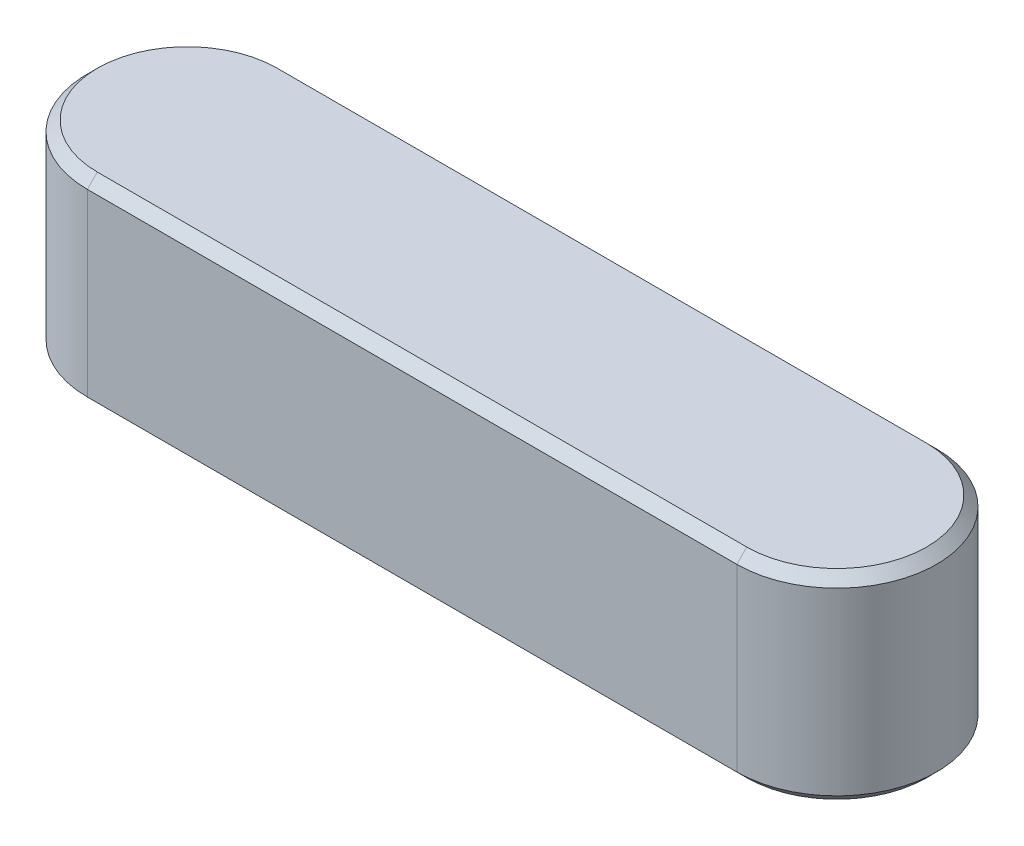
ISO-10303-21;
HEADER;
FILE_DESCRIPTION(('STEP AP214'),'2;1');
FILE_NAME('part.step','',(''),(''),'','','');
FILE_SCHEMA(('AUTOMOTIVE_DESIGN { 1 0 10303 214 1 1 1 1 }'));
ENDSEC;
DATA;
#1=APPLICATION_CONTEXT('core data for automotive mechanical design processes');
#2=APPLICATION_PROTOCOL_DEFINITION('international standard','automotive_design',2000,#1);
#3=PRODUCT_CONTEXT('',#1,'mechanical');
#4=PRODUCT('Part','Part','',(#3));
#5=PRODUCT_RELATED_PRODUCT_CATEGORY('part','',(#4));
#6=PRODUCT_DEFINITION_FORMATION('','',#4);
#7=PRODUCT_DEFINITION_CONTEXT('part definition',#1,'design');
#8=PRODUCT_DEFINITION('design','',#6,#7);
#9=PRODUCT_DEFINITION_SHAPE('','',#8);
#10=(LENGTH_UNIT() NAMED_UNIT(*) SI_UNIT(.MILLI.,.METRE.));
#11=(NAMED_UNIT(*) PLANE_ANGLE_UNIT() SI_UNIT($,.RADIAN.));
#12=(NAMED_UNIT(*) SI_UNIT($,.STERADIAN.) SOLID_ANGLE_UNIT());
#13=UNCERTAINTY_MEASURE_WITH_UNIT(LENGTH_MEASURE(1.E-05),#10,'distance_accuracy_value','');
#14=(GEOMETRIC_REPRESENTATION_CONTEXT(3) GLOBAL_UNCERTAINTY_ASSIGNED_CONTEXT((#13)) GLOBAL_UNIT_ASSIGNED_CONTEXT((#10,
#11,#12)) REPRESENTATION_CONTEXT('',''));
#15=CARTESIAN_POINT('',(0.,0.,0.));
#16=DIRECTION('',(0.,0.,1.));
#17=DIRECTION('',(1.,0.,0.));
#18=AXIS2_PLACEMENT_3D('',#15,#16,#17);
#19=CARTESIAN_POINT('',(0.,4.,0.));
#20=DIRECTION('',(0.,-1.,0.));
#21=DIRECTION('',(0.,0.,-1.));
#22=AXIS2_PLACEMENT_3D('',#19,#20,#21);
#23=CYLINDRICAL_SURFACE('',#22,2.);
#24=DIRECTION('',(0.,-1.,0.));
#25=VECTOR('',#24,1.);
#26=CARTESIAN_POINT('',(0.,4.,-2.));
#27=LINE('',#26,#25);
#28=CARTESIAN_POINT('',(0.,3.8,-2.));
#29=VERTEX_POINT('',#28);
#30=CARTESIAN_POINT('',(0.,0.200000000000002,-2.));
#31=VERTEX_POINT('',#30);
#32=EDGE_CURVE('E158',#29,#31,#27,.T.);
#33=ORIENTED_EDGE('',*,*,#32,.T.);
#34=CARTESIAN_POINT('',(0.,0.200000000000002,0.));
#35=DIRECTION('',(0.,1.,0.));
#36=DIRECTION('',(0.,0.,1.));
#37=AXIS2_PLACEMENT_3D('',#34,#35,#36);
#38=CIRCLE('',#37,2.);
#39=CARTESIAN_POINT('',(0.,0.200000000000002,2.));
#40=VERTEX_POINT('',#39);
#41=EDGE_CURVE('E172',#31,#40,#38,.T.);
#42=ORIENTED_EDGE('',*,*,#41,.T.);
#43=DIRECTION('',(0.,-1.,0.));
#44=VECTOR('',#43,1.);
#45=CARTESIAN_POINT('',(0.,4.,2.));
#46=LINE('',#45,#44);
#47=CARTESIAN_POINT('',(0.,3.8,2.));
#48=VERTEX_POINT('',#47);
#49=EDGE_CURVE('E129',#48,#40,#46,.T.);
#50=ORIENTED_EDGE('',*,*,#49,.F.);
#51=CARTESIAN_POINT('',(0.,3.8,0.));
#52=DIRECTION('',(0.,1.,0.));
#53=DIRECTION('',(0.,0.,1.));
#54=AXIS2_PLACEMENT_3D('',#51,#52,#53);
#55=CIRCLE('',#54,2.);
#56=EDGE_CURVE('E175',#48,#29,#55,.F.);
#57=ORIENTED_EDGE('',*,*,#56,.T.);
#58=EDGE_LOOP('',(#33,#42,#50,#57));
#59=FACE_BOUND('',#58,.T.);
#60=ADVANCED_FACE('F39',(#59),#23,.T.);
#61=CARTESIAN_POINT('',(0.,4.,2.));
#62=DIRECTION('',(0.,0.,-1.));
#63=DIRECTION('',(-1.,0.,0.));
#64=AXIS2_PLACEMENT_3D('',#61,#62,#63);
#65=PLANE('',#64);
#66=ORIENTED_EDGE('',*,*,#49,.T.);
#67=DIRECTION('',(1.,0.,0.));
#68=VECTOR('',#67,1.);
#69=CARTESIAN_POINT('',(0.,0.200000000000002,2.));
#70=LINE('',#69,#68);
#71=CARTESIAN_POINT('',(13.,0.200000000000002,2.));
#72=VERTEX_POINT('',#71);
#73=EDGE_CURVE('E127',#40,#72,#70,.T.);
#74=ORIENTED_EDGE('',*,*,#73,.T.);
#75=DIRECTION('',(0.,-1.,0.));
#76=VECTOR('',#75,1.);
#77=CARTESIAN_POINT('',(13.,4.,2.));
#78=LINE('',#77,#76);
#79=CARTESIAN_POINT('',(13.,3.8,2.));
#80=VERTEX_POINT('',#79);
#81=EDGE_CURVE('E109',#80,#72,#78,.T.);
#82=ORIENTED_EDGE('',*,*,#81,.F.);
#83=DIRECTION('',(-1.,0.,0.));
#84=VECTOR('',#83,1.);
#85=CARTESIAN_POINT('',(0.,3.8,2.));
#86=LINE('',#85,#84);
#87=EDGE_CURVE('E124',#80,#48,#86,.T.);
#88=ORIENTED_EDGE('',*,*,#87,.T.);
#89=EDGE_LOOP('',(#66,#74,#82,#88));
#90=FACE_BOUND('',#89,.T.);
#91=ADVANCED_FACE('F123',(#90),#65,.F.);
#92=CARTESIAN_POINT('',(13.,4.,0.));
#93=DIRECTION('',(0.,-1.,0.));
#94=DIRECTION('',(0.,0.,-1.));
#95=AXIS2_PLACEMENT_3D('',#92,#93,#94);
#96=CYLINDRICAL_SURFACE('',#95,2.);
#97=ORIENTED_EDGE('',*,*,#81,.T.);
#98=CARTESIAN_POINT('',(13.,0.200000000000002,0.));
#99=DIRECTION('',(0.,1.,0.));
#100=DIRECTION('',(0.,0.,1.));
#101=AXIS2_PLACEMENT_3D('',#98,#99,#100);
#102=CIRCLE('',#101,2.);
#103=CARTESIAN_POINT('',(13.,0.200000000000002,-2.));
#104=VERTEX_POINT('',#103);
#105=EDGE_CURVE('E116',#72,#104,#102,.T.);
#106=ORIENTED_EDGE('',*,*,#105,.T.);
#107=DIRECTION('',(0.,-1.,0.));
#108=VECTOR('',#107,1.);
#109=CARTESIAN_POINT('',(13.,4.,-2.));
#110=LINE('',#109,#108);
#111=CARTESIAN_POINT('',(13.,3.8,-2.));
#112=VERTEX_POINT('',#111);
#113=EDGE_CURVE('E111',#112,#104,#110,.T.);
#114=ORIENTED_EDGE('',*,*,#113,.F.);
#115=CARTESIAN_POINT('',(13.,3.8,0.));
#116=DIRECTION('',(0.,1.,0.));
#117=DIRECTION('',(0.,0.,1.));
#118=AXIS2_PLACEMENT_3D('',#115,#116,#117);
#119=CIRCLE('',#118,2.);
#120=EDGE_CURVE('E106',#112,#80,#119,.F.);
#121=ORIENTED_EDGE('',*,*,#120,.T.);
#122=EDGE_LOOP('',(#97,#106,#114,#121));
#123=FACE_BOUND('',#122,.T.);
#124=ADVANCED_FACE('F108',(#123),#96,.T.);
#125=CARTESIAN_POINT('',(0.,4.,-2.));
#126=DIRECTION('',(0.,0.,1.));
#127=DIRECTION('',(1.,0.,0.));
#128=AXIS2_PLACEMENT_3D('',#125,#126,#127);
#129=PLANE('',#128);
#130=ORIENTED_EDGE('',*,*,#113,.T.);
#131=DIRECTION('',(-1.,0.,0.));
#132=VECTOR('',#131,1.);
#133=CARTESIAN_POINT('',(0.,0.200000000000002,-2.));
#134=LINE('',#133,#132);
#135=EDGE_CURVE('E178',#104,#31,#134,.T.);
#136=ORIENTED_EDGE('',*,*,#135,.T.);
#137=ORIENTED_EDGE('',*,*,#32,.F.);
#138=DIRECTION('',(1.,0.,0.));
#139=VECTOR('',#138,1.);
#140=CARTESIAN_POINT('',(13.,3.8,-2.));
#141=LINE('',#140,#139);
#142=EDGE_CURVE('E181',#29,#112,#141,.T.);
#143=ORIENTED_EDGE('',*,*,#142,.T.);
#144=EDGE_LOOP('',(#130,#136,#137,#143));
#145=FACE_BOUND('',#144,.T.);
#146=ADVANCED_FACE('F229',(#145),#129,.F.);
#147=CARTESIAN_POINT('',(0.,4.,0.));
#148=DIRECTION('',(0.,1.,0.));
#149=DIRECTION('',(0.,0.,1.));
#150=AXIS2_PLACEMENT_3D('',#147,#148,#149);
#151=PLANE('',#150);
#152=CARTESIAN_POINT('',(13.,4.,0.));
#153=DIRECTION('',(0.,1.,0.));
#154=DIRECTION('',(0.,0.,1.));
#155=AXIS2_PLACEMENT_3D('',#152,#153,#154);
#156=CIRCLE('',#155,1.8);
#157=CARTESIAN_POINT('',(13.,4.,1.8));
#158=VERTEX_POINT('',#157);
#159=CARTESIAN_POINT('',(13.,4.,-1.8));
#160=VERTEX_POINT('',#159);
#161=EDGE_CURVE('E49',#158,#160,#156,.T.);
#162=ORIENTED_EDGE('',*,*,#161,.T.);
#163=DIRECTION('',(-1.,0.,0.));
#164=VECTOR('',#163,1.);
#165=CARTESIAN_POINT('',(0.,4.,-1.8));
#166=LINE('',#165,#164);
#167=CARTESIAN_POINT('',(0.,4.,-1.8));
#168=VERTEX_POINT('',#167);
#169=EDGE_CURVE('E11',#160,#168,#166,.T.);
#170=ORIENTED_EDGE('',*,*,#169,.T.);
#171=CARTESIAN_POINT('',(0.,4.,0.));
#172=DIRECTION('',(0.,1.,0.));
#173=DIRECTION('',(0.,0.,1.));
#174=AXIS2_PLACEMENT_3D('',#171,#172,#173);
#175=CIRCLE('',#174,1.8);
#176=CARTESIAN_POINT('',(0.,4.,1.8));
#177=VERTEX_POINT('',#176);
#178=EDGE_CURVE('E169',#168,#177,#175,.T.);
#179=ORIENTED_EDGE('',*,*,#178,.T.);
#180=DIRECTION('',(1.,0.,0.));
#181=VECTOR('',#180,1.);
#182=CARTESIAN_POINT('',(13.,4.,1.8));
#183=LINE('',#182,#181);
#184=EDGE_CURVE('E60',#177,#158,#183,.T.);
#185=ORIENTED_EDGE('',*,*,#184,.T.);
#186=EDGE_LOOP('',(#162,#170,#179,#185));
#187=FACE_BOUND('',#186,.T.);
#188=ADVANCED_FACE('F235',(#187),#151,.T.);
#189=CARTESIAN_POINT('',(0.,0.,0.));
#190=DIRECTION('',(0.,1.,0.));
#191=DIRECTION('',(0.,0.,1.));
#192=AXIS2_PLACEMENT_3D('',#189,#190,#191);
#193=PLANE('',#192);
#194=CARTESIAN_POINT('',(13.,0.,0.));
#195=DIRECTION('',(0.,1.,0.));
#196=DIRECTION('',(0.,0.,1.));
#197=AXIS2_PLACEMENT_3D('',#194,#195,#196);
#198=CIRCLE('',#197,1.8);
#199=CARTESIAN_POINT('',(13.,0.,-1.8));
#200=VERTEX_POINT('',#199);
#201=CARTESIAN_POINT('',(13.,0.,1.8));
#202=VERTEX_POINT('',#201);
#203=EDGE_CURVE('E189',#200,#202,#198,.F.);
#204=ORIENTED_EDGE('',*,*,#203,.T.);
#205=DIRECTION('',(-1.,0.,0.));
#206=VECTOR('',#205,1.);
#207=CARTESIAN_POINT('',(0.,0.,1.8));
#208=LINE('',#207,#206);
#209=CARTESIAN_POINT('',(0.,0.,1.8));
#210=VERTEX_POINT('',#209);
#211=EDGE_CURVE('E117',#202,#210,#208,.T.);
#212=ORIENTED_EDGE('',*,*,#211,.T.);
#213=CARTESIAN_POINT('',(0.,0.,0.));
#214=DIRECTION('',(0.,1.,0.));
#215=DIRECTION('',(0.,0.,1.));
#216=AXIS2_PLACEMENT_3D('',#213,#214,#215);
#217=CIRCLE('',#216,1.8);
#218=CARTESIAN_POINT('',(0.,0.,-1.8));
#219=VERTEX_POINT('',#218);
#220=EDGE_CURVE('E195',#210,#219,#217,.F.);
#221=ORIENTED_EDGE('',*,*,#220,.T.);
#222=DIRECTION('',(1.,0.,0.));
#223=VECTOR('',#222,1.);
#224=CARTESIAN_POINT('',(0.,0.,-1.8));
#225=LINE('',#224,#223);
#226=EDGE_CURVE('E192',#219,#200,#225,.T.);
#227=ORIENTED_EDGE('',*,*,#226,.T.);
#228=EDGE_LOOP('',(#204,#212,#221,#227));
#229=FACE_BOUND('',#228,.T.);
#230=ADVANCED_FACE('F237',(#229),#193,.F.);
#231=CARTESIAN_POINT('',(0.,0.200000000000002,-2.));
#232=DIRECTION('',(0.,0.707106781186551,0.707106781186544));
#233=DIRECTION('',(-1.,0.,0.));
#234=AXIS2_PLACEMENT_3D('',#231,#232,#233);
#235=PLANE('',#234);
#236=DIRECTION('',(0.,0.707106781186544,-0.707106781186551));
#237=VECTOR('',#236,1.);
#238=CARTESIAN_POINT('',(13.,0.,-1.8));
#239=LINE('',#238,#237);
#240=EDGE_CURVE('E159',#200,#104,#239,.T.);
#241=ORIENTED_EDGE('',*,*,#240,.F.);
#242=ORIENTED_EDGE('',*,*,#226,.F.);
#243=DIRECTION('',(0.,-0.707106781186544,0.707106781186551));
#244=VECTOR('',#243,1.);
#245=CARTESIAN_POINT('',(0.,0.200000000000002,-2.));
#246=LINE('',#245,#244);
#247=EDGE_CURVE('E154',#31,#219,#246,.T.);
#248=ORIENTED_EDGE('',*,*,#247,.F.);
#249=ORIENTED_EDGE('',*,*,#135,.F.);
#250=EDGE_LOOP('',(#241,#242,#248,#249));
#251=FACE_BOUND('',#250,.T.);
#252=ADVANCED_FACE('F216',(#251),#235,.F.);
#253=CARTESIAN_POINT('',(0.,0.200000000000002,0.));
#254=DIRECTION('',(0.,1.,0.));
#255=DIRECTION('',(0.,0.,1.));
#256=AXIS2_PLACEMENT_3D('',#253,#254,#255);
#257=CONICAL_SURFACE('',#256,2.,0.785398163397453);
#258=ORIENTED_EDGE('',*,*,#247,.T.);
#259=ORIENTED_EDGE('',*,*,#220,.F.);
#260=DIRECTION('',(0.,-0.707106781186544,-0.707106781186551));
#261=VECTOR('',#260,1.);
#262=CARTESIAN_POINT('',(0.,0.200000000000002,2.));
#263=LINE('',#262,#261);
#264=EDGE_CURVE('E143',#40,#210,#263,.T.);
#265=ORIENTED_EDGE('',*,*,#264,.F.);
#266=ORIENTED_EDGE('',*,*,#41,.F.);
#267=EDGE_LOOP('',(#258,#259,#265,#266));
#268=FACE_BOUND('',#267,.T.);
#269=ADVANCED_FACE('F220',(#268),#257,.T.);
#270=CARTESIAN_POINT('',(13.,0.200000000000002,0.));
#271=DIRECTION('',(0.,1.,0.));
#272=DIRECTION('',(0.,0.,1.));
#273=AXIS2_PLACEMENT_3D('',#270,#271,#272);
#274=CONICAL_SURFACE('',#273,2.,0.785398163397453);
#275=ORIENTED_EDGE('',*,*,#240,.T.);
#276=ORIENTED_EDGE('',*,*,#105,.F.);
#277=DIRECTION('',(0.,0.707106781186544,0.707106781186551));
#278=VECTOR('',#277,1.);
#279=CARTESIAN_POINT('',(13.,0.,1.8));
#280=LINE('',#279,#278);
#281=EDGE_CURVE('E140',#202,#72,#280,.T.);
#282=ORIENTED_EDGE('',*,*,#281,.F.);
#283=ORIENTED_EDGE('',*,*,#203,.F.);
#284=EDGE_LOOP('',(#275,#276,#282,#283));
#285=FACE_BOUND('',#284,.T.);
#286=ADVANCED_FACE('F228',(#285),#274,.T.);
#287=CARTESIAN_POINT('',(0.,0.200000000000002,2.));
#288=DIRECTION('',(0.,0.707106781186551,-0.707106781186544));
#289=DIRECTION('',(1.,0.,0.));
#290=AXIS2_PLACEMENT_3D('',#287,#288,#289);
#291=PLANE('',#290);
#292=ORIENTED_EDGE('',*,*,#264,.T.);
#293=ORIENTED_EDGE('',*,*,#211,.F.);
#294=ORIENTED_EDGE('',*,*,#281,.T.);
#295=ORIENTED_EDGE('',*,*,#73,.F.);
#296=EDGE_LOOP('',(#292,#293,#294,#295));
#297=FACE_BOUND('',#296,.T.);
#298=ADVANCED_FACE('F223',(#297),#291,.F.);
#299=CARTESIAN_POINT('',(0.,4.,1.8));
#300=DIRECTION('',(0.,0.707106781186547,0.707106781186547));
#301=DIRECTION('',(-1.,0.,0.));
#302=AXIS2_PLACEMENT_3D('',#299,#300,#301);
#303=PLANE('',#302);
#304=DIRECTION('',(0.,0.707106781186547,-0.707106781186547));
#305=VECTOR('',#304,1.);
#306=CARTESIAN_POINT('',(0.,3.8,2.));
#307=LINE('',#306,#305);
#308=EDGE_CURVE('E134',#48,#177,#307,.T.);
#309=ORIENTED_EDGE('',*,*,#308,.F.);
#310=ORIENTED_EDGE('',*,*,#87,.F.);
#311=DIRECTION('',(0.,-0.707106781186547,0.707106781186547));
#312=VECTOR('',#311,1.);
#313=CARTESIAN_POINT('',(13.,4.,1.8));
#314=LINE('',#313,#312);
#315=EDGE_CURVE('E43',#158,#80,#314,.T.);
#316=ORIENTED_EDGE('',*,*,#315,.F.);
#317=ORIENTED_EDGE('',*,*,#184,.F.);
#318=EDGE_LOOP('',(#309,#310,#316,#317));
#319=FACE_BOUND('',#318,.T.);
#320=ADVANCED_FACE('F41',(#319),#303,.T.);
#321=CARTESIAN_POINT('',(13.,4.,0.));
#322=DIRECTION('',(0.,-1.,0.));
#323=DIRECTION('',(0.,0.,-1.));
#324=AXIS2_PLACEMENT_3D('',#321,#322,#323);
#325=CONICAL_SURFACE('',#324,1.8,0.785398163397448);
#326=ORIENTED_EDGE('',*,*,#315,.T.);
#327=ORIENTED_EDGE('',*,*,#120,.F.);
#328=DIRECTION('',(0.,-0.707106781186547,-0.707106781186547));
#329=VECTOR('',#328,1.);
#330=CARTESIAN_POINT('',(13.,4.,-1.8));
#331=LINE('',#330,#329);
#332=EDGE_CURVE('E145',#160,#112,#331,.T.);
#333=ORIENTED_EDGE('',*,*,#332,.F.);
#334=ORIENTED_EDGE('',*,*,#161,.F.);
#335=EDGE_LOOP('',(#326,#327,#333,#334));
#336=FACE_BOUND('',#335,.T.);
#337=ADVANCED_FACE('F138',(#336),#325,.T.);
#338=CARTESIAN_POINT('',(0.,4.,0.));
#339=DIRECTION('',(0.,-1.,0.));
#340=DIRECTION('',(0.,0.,-1.));
#341=AXIS2_PLACEMENT_3D('',#338,#339,#340);
#342=CONICAL_SURFACE('',#341,1.8,0.785398163397448);
#343=ORIENTED_EDGE('',*,*,#308,.T.);
#344=ORIENTED_EDGE('',*,*,#178,.F.);
#345=DIRECTION('',(0.,0.707106781186547,0.707106781186547));
#346=VECTOR('',#345,1.);
#347=CARTESIAN_POINT('',(0.,3.8,-2.));
#348=LINE('',#347,#346);
#349=EDGE_CURVE('E149',#29,#168,#348,.T.);
#350=ORIENTED_EDGE('',*,*,#349,.F.);
#351=ORIENTED_EDGE('',*,*,#56,.F.);
#352=EDGE_LOOP('',(#343,#344,#350,#351));
#353=FACE_BOUND('',#352,.T.);
#354=ADVANCED_FACE('F234',(#353),#342,.T.);
#355=CARTESIAN_POINT('',(0.,4.,-1.8));
#356=DIRECTION('',(0.,0.707106781186547,-0.707106781186547));
#357=DIRECTION('',(1.,0.,0.));
#358=AXIS2_PLACEMENT_3D('',#355,#356,#357);
#359=PLANE('',#358);
#360=ORIENTED_EDGE('',*,*,#332,.T.);
#361=ORIENTED_EDGE('',*,*,#142,.F.);
#362=ORIENTED_EDGE('',*,*,#349,.T.);
#363=ORIENTED_EDGE('',*,*,#169,.F.);
#364=EDGE_LOOP('',(#360,#361,#362,#363));
#365=FACE_BOUND('',#364,.T.);
#366=ADVANCED_FACE('F232',(#365),#359,.T.);
#367=CLOSED_SHELL('',(#60,#91,#124,#146,#188,#230,#252,#269,#286,#298,#320,#337,#354,#366));
#368=MANIFOLD_SOLID_BREP('B2',#367);
#369=ADVANCED_BREP_SHAPE_REPRESENTATION('',(#18,#368),#14);
#370=SHAPE_DEFINITION_REPRESENTATION(#9,#369);
ENDSEC;
END-ISO-10303-21;
